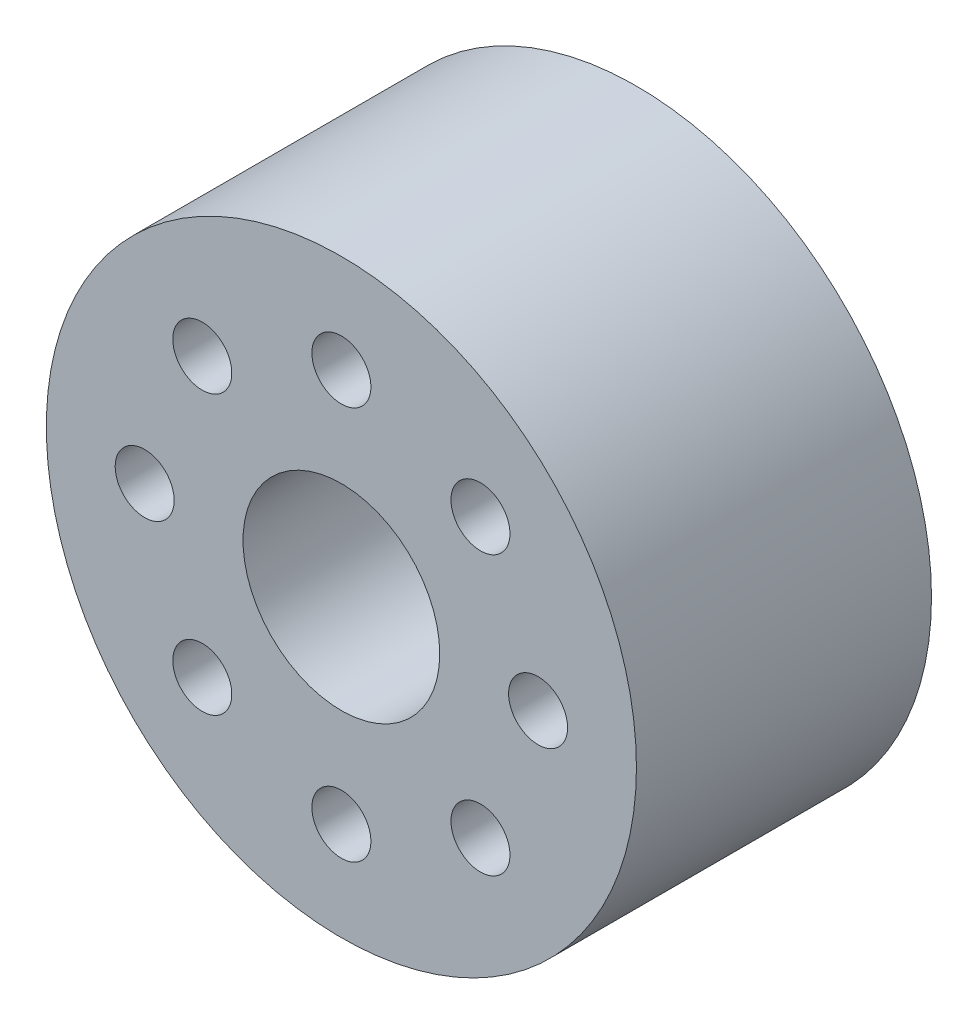
ISO-10303-21;
HEADER;
FILE_DESCRIPTION(('STEP AP214'),'2;1');
FILE_NAME('part.step','',(''),(''),'','','');
FILE_SCHEMA(('AUTOMOTIVE_DESIGN { 1 0 10303 214 1 1 1 1 }'));
ENDSEC;
DATA;
#1=APPLICATION_CONTEXT('core data for automotive mechanical design processes');
#2=APPLICATION_PROTOCOL_DEFINITION('international standard','automotive_design',2000,#1);
#3=PRODUCT_CONTEXT('',#1,'mechanical');
#4=PRODUCT('Part','Part','',(#3));
#5=PRODUCT_RELATED_PRODUCT_CATEGORY('part','',(#4));
#6=PRODUCT_DEFINITION_FORMATION('','',#4);
#7=PRODUCT_DEFINITION_CONTEXT('part definition',#1,'design');
#8=PRODUCT_DEFINITION('design','',#6,#7);
#9=PRODUCT_DEFINITION_SHAPE('','',#8);
#10=(LENGTH_UNIT() NAMED_UNIT(*) SI_UNIT(.MILLI.,.METRE.));
#11=(NAMED_UNIT(*) PLANE_ANGLE_UNIT() SI_UNIT($,.RADIAN.));
#12=(NAMED_UNIT(*) SI_UNIT($,.STERADIAN.) SOLID_ANGLE_UNIT());
#13=UNCERTAINTY_MEASURE_WITH_UNIT(LENGTH_MEASURE(1.E-05),#10,'distance_accuracy_value','');
#14=(GEOMETRIC_REPRESENTATION_CONTEXT(3) GLOBAL_UNCERTAINTY_ASSIGNED_CONTEXT((#13)) GLOBAL_UNIT_ASSIGNED_CONTEXT((#10,
#11,#12)) REPRESENTATION_CONTEXT('',''));
#15=CARTESIAN_POINT('',(0.,0.,0.));
#16=DIRECTION('',(0.,0.,1.));
#17=DIRECTION('',(1.,0.,0.));
#18=AXIS2_PLACEMENT_3D('',#15,#16,#17);
#19=CARTESIAN_POINT('',(0.,0.,12.));
#20=DIRECTION('',(0.,0.,-1.));
#21=DIRECTION('',(-1.,0.,0.));
#22=AXIS2_PLACEMENT_3D('',#19,#20,#21);
#23=CYLINDRICAL_SURFACE('',#22,12.);
#24=CARTESIAN_POINT('',(0.,0.,12.));
#25=DIRECTION('',(0.,0.,1.));
#26=DIRECTION('',(1.,0.,0.));
#27=AXIS2_PLACEMENT_3D('',#24,#25,#26);
#28=CIRCLE('',#27,12.);
#29=CARTESIAN_POINT('',(12.,0.,12.));
#30=VERTEX_POINT('',#29);
#31=EDGE_CURVE('E10',#30,#30,#28,.T.);
#32=ORIENTED_EDGE('',*,*,#31,.F.);
#33=EDGE_LOOP('',(#32));
#34=FACE_BOUND('',#33,.T.);
#35=CARTESIAN_POINT('',(0.,0.,0.));
#36=DIRECTION('',(0.,0.,1.));
#37=DIRECTION('',(1.,0.,0.));
#38=AXIS2_PLACEMENT_3D('',#35,#36,#37);
#39=CIRCLE('',#38,12.);
#40=CARTESIAN_POINT('',(12.,0.,0.));
#41=VERTEX_POINT('',#40);
#42=EDGE_CURVE('E46',#41,#41,#39,.T.);
#43=ORIENTED_EDGE('',*,*,#42,.T.);
#44=EDGE_LOOP('',(#43));
#45=FACE_BOUND('',#44,.T.);
#46=ADVANCED_FACE('F43',(#34,#45),#23,.T.);
#47=CARTESIAN_POINT('',(0.,0.,12.));
#48=DIRECTION('',(0.,0.,1.));
#49=DIRECTION('',(1.,0.,0.));
#50=AXIS2_PLACEMENT_3D('',#47,#48,#49);
#51=PLANE('',#50);
#52=CARTESIAN_POINT('',(0.,8.,12.));
#53=DIRECTION('',(0.,0.,-1.));
#54=DIRECTION('',(-1.,0.,0.));
#55=AXIS2_PLACEMENT_3D('',#52,#53,#54);
#56=CIRCLE('',#55,1.2);
#57=CARTESIAN_POINT('',(-1.2,8.,12.));
#58=VERTEX_POINT('',#57);
#59=EDGE_CURVE('E176',#58,#58,#56,.T.);
#60=ORIENTED_EDGE('',*,*,#59,.T.);
#61=EDGE_LOOP('',(#60));
#62=FACE_BOUND('',#61,.T.);
#63=CARTESIAN_POINT('',(5.65685424949248,5.65685424949262,12.));
#64=DIRECTION('',(0.,0.,-1.));
#65=DIRECTION('',(-1.,0.,0.));
#66=AXIS2_PLACEMENT_3D('',#63,#64,#65);
#67=CIRCLE('',#66,1.2);
#68=CARTESIAN_POINT('',(4.45685424949248,5.65685424949262,12.));
#69=VERTEX_POINT('',#68);
#70=EDGE_CURVE('E160',#69,#69,#67,.T.);
#71=ORIENTED_EDGE('',*,*,#70,.T.);
#72=EDGE_LOOP('',(#71));
#73=FACE_BOUND('',#72,.T.);
#74=CARTESIAN_POINT('',(8.00000000000034,3.39590937005871E-13,12.));
#75=DIRECTION('',(0.,0.,-1.));
#76=DIRECTION('',(-1.,0.,0.));
#77=AXIS2_PLACEMENT_3D('',#74,#75,#76);
#78=CIRCLE('',#77,1.2);
#79=CARTESIAN_POINT('',(6.80000000000034,3.39590937005871E-13,12.));
#80=VERTEX_POINT('',#79);
#81=EDGE_CURVE('E144',#80,#80,#78,.T.);
#82=ORIENTED_EDGE('',*,*,#81,.T.);
#83=EDGE_LOOP('',(#82));
#84=FACE_BOUND('',#83,.T.);
#85=CARTESIAN_POINT('',(5.65685424949296,-5.65685424949214,12.));
#86=DIRECTION('',(0.,0.,-1.));
#87=DIRECTION('',(-1.,0.,0.));
#88=AXIS2_PLACEMENT_3D('',#85,#86,#87);
#89=CIRCLE('',#88,1.2);
#90=CARTESIAN_POINT('',(4.45685424949296,-5.65685424949214,12.));
#91=VERTEX_POINT('',#90);
#92=EDGE_CURVE('E128',#91,#91,#89,.T.);
#93=ORIENTED_EDGE('',*,*,#92,.T.);
#94=EDGE_LOOP('',(#93));
#95=FACE_BOUND('',#94,.T.);
#96=CARTESIAN_POINT('',(6.79181874011743E-13,-8.,12.));
#97=DIRECTION('',(0.,0.,-1.));
#98=DIRECTION('',(-1.,0.,0.));
#99=AXIS2_PLACEMENT_3D('',#96,#97,#98);
#100=CIRCLE('',#99,1.2);
#101=CARTESIAN_POINT('',(-1.19999999999932,-8.,12.));
#102=VERTEX_POINT('',#101);
#103=EDGE_CURVE('E112',#102,#102,#100,.T.);
#104=ORIENTED_EDGE('',*,*,#103,.T.);
#105=EDGE_LOOP('',(#104));
#106=FACE_BOUND('',#105,.T.);
#107=CARTESIAN_POINT('',(-5.6568542494918,-5.65685424949262,12.));
#108=DIRECTION('',(0.,0.,-1.));
#109=DIRECTION('',(-1.,0.,0.));
#110=AXIS2_PLACEMENT_3D('',#107,#108,#109);
#111=CIRCLE('',#110,1.2);
#112=CARTESIAN_POINT('',(-6.8568542494918,-5.65685424949262,12.));
#113=VERTEX_POINT('',#112);
#114=EDGE_CURVE('E96',#113,#113,#111,.T.);
#115=ORIENTED_EDGE('',*,*,#114,.T.);
#116=EDGE_LOOP('',(#115));
#117=FACE_BOUND('',#116,.T.);
#118=CARTESIAN_POINT('',(-7.99999999999966,-3.40570654445189E-13,12.));
#119=DIRECTION('',(0.,0.,-1.));
#120=DIRECTION('',(-1.,0.,0.));
#121=AXIS2_PLACEMENT_3D('',#118,#119,#120);
#122=CIRCLE('',#121,1.2);
#123=CARTESIAN_POINT('',(-9.19999999999966,-3.40570654445189E-13,12.));
#124=VERTEX_POINT('',#123);
#125=EDGE_CURVE('E80',#124,#124,#122,.T.);
#126=ORIENTED_EDGE('',*,*,#125,.T.);
#127=EDGE_LOOP('',(#126));
#128=FACE_BOUND('',#127,.T.);
#129=CARTESIAN_POINT('',(-5.65685424949228,5.65685424949214,12.));
#130=DIRECTION('',(0.,0.,-1.));
#131=DIRECTION('',(-1.,0.,0.));
#132=AXIS2_PLACEMENT_3D('',#129,#130,#131);
#133=CIRCLE('',#132,1.2);
#134=CARTESIAN_POINT('',(-6.85685424949228,5.65685424949214,12.));
#135=VERTEX_POINT('',#134);
#136=EDGE_CURVE('E64',#135,#135,#133,.T.);
#137=ORIENTED_EDGE('',*,*,#136,.T.);
#138=EDGE_LOOP('',(#137));
#139=FACE_BOUND('',#138,.T.);
#140=CARTESIAN_POINT('',(0.,0.,12.));
#141=DIRECTION('',(0.,0.,1.));
#142=DIRECTION('',(1.,0.,0.));
#143=AXIS2_PLACEMENT_3D('',#140,#141,#142);
#144=CIRCLE('',#143,4.);
#145=CARTESIAN_POINT('',(4.,0.,12.));
#146=VERTEX_POINT('',#145);
#147=EDGE_CURVE('E60',#146,#146,#144,.T.);
#148=ORIENTED_EDGE('',*,*,#147,.F.);
#149=EDGE_LOOP('',(#148));
#150=FACE_BOUND('',#149,.T.);
#151=ORIENTED_EDGE('',*,*,#31,.T.);
#152=EDGE_LOOP('',(#151));
#153=FACE_BOUND('',#152,.T.);
#154=ADVANCED_FACE('F199',(#62,#73,#84,#95,#106,#117,#128,#139,#150,#153),#51,.T.);
#155=CARTESIAN_POINT('',(0.,0.,0.));
#156=DIRECTION('',(0.,0.,1.));
#157=DIRECTION('',(1.,0.,0.));
#158=AXIS2_PLACEMENT_3D('',#155,#156,#157);
#159=PLANE('',#158);
#160=CARTESIAN_POINT('',(0.,8.,0.));
#161=DIRECTION('',(0.,0.,-1.));
#162=DIRECTION('',(-1.,0.,0.));
#163=AXIS2_PLACEMENT_3D('',#160,#161,#162);
#164=CIRCLE('',#163,2.2);
#165=CARTESIAN_POINT('',(-2.2,8.,0.));
#166=VERTEX_POINT('',#165);
#167=EDGE_CURVE('E188',#166,#166,#164,.T.);
#168=ORIENTED_EDGE('',*,*,#167,.F.);
#169=EDGE_LOOP('',(#168));
#170=FACE_BOUND('',#169,.T.);
#171=CARTESIAN_POINT('',(5.65685424949248,5.65685424949262,0.));
#172=DIRECTION('',(0.,0.,-1.));
#173=DIRECTION('',(-1.,0.,0.));
#174=AXIS2_PLACEMENT_3D('',#171,#172,#173);
#175=CIRCLE('',#174,2.2);
#176=CARTESIAN_POINT('',(3.45685424949248,5.65685424949262,0.));
#177=VERTEX_POINT('',#176);
#178=EDGE_CURVE('E172',#177,#177,#175,.T.);
#179=ORIENTED_EDGE('',*,*,#178,.F.);
#180=EDGE_LOOP('',(#179));
#181=FACE_BOUND('',#180,.T.);
#182=CARTESIAN_POINT('',(8.00000000000034,3.39590937005871E-13,0.));
#183=DIRECTION('',(0.,0.,-1.));
#184=DIRECTION('',(-1.,0.,0.));
#185=AXIS2_PLACEMENT_3D('',#182,#183,#184);
#186=CIRCLE('',#185,2.2);
#187=CARTESIAN_POINT('',(5.80000000000034,3.39590937005871E-13,0.));
#188=VERTEX_POINT('',#187);
#189=EDGE_CURVE('E156',#188,#188,#186,.T.);
#190=ORIENTED_EDGE('',*,*,#189,.F.);
#191=EDGE_LOOP('',(#190));
#192=FACE_BOUND('',#191,.T.);
#193=CARTESIAN_POINT('',(5.65685424949296,-5.65685424949214,0.));
#194=DIRECTION('',(0.,0.,-1.));
#195=DIRECTION('',(-1.,0.,0.));
#196=AXIS2_PLACEMENT_3D('',#193,#194,#195);
#197=CIRCLE('',#196,2.2);
#198=CARTESIAN_POINT('',(3.45685424949296,-5.65685424949214,0.));
#199=VERTEX_POINT('',#198);
#200=EDGE_CURVE('E140',#199,#199,#197,.T.);
#201=ORIENTED_EDGE('',*,*,#200,.F.);
#202=EDGE_LOOP('',(#201));
#203=FACE_BOUND('',#202,.T.);
#204=CARTESIAN_POINT('',(6.79181874011743E-13,-8.,0.));
#205=DIRECTION('',(0.,0.,-1.));
#206=DIRECTION('',(-1.,0.,0.));
#207=AXIS2_PLACEMENT_3D('',#204,#205,#206);
#208=CIRCLE('',#207,2.2);
#209=CARTESIAN_POINT('',(-2.19999999999932,-8.,0.));
#210=VERTEX_POINT('',#209);
#211=EDGE_CURVE('E124',#210,#210,#208,.T.);
#212=ORIENTED_EDGE('',*,*,#211,.F.);
#213=EDGE_LOOP('',(#212));
#214=FACE_BOUND('',#213,.T.);
#215=CARTESIAN_POINT('',(-5.6568542494918,-5.65685424949262,0.));
#216=DIRECTION('',(0.,0.,-1.));
#217=DIRECTION('',(-1.,0.,0.));
#218=AXIS2_PLACEMENT_3D('',#215,#216,#217);
#219=CIRCLE('',#218,2.2);
#220=CARTESIAN_POINT('',(-7.8568542494918,-5.65685424949262,0.));
#221=VERTEX_POINT('',#220);
#222=EDGE_CURVE('E108',#221,#221,#219,.T.);
#223=ORIENTED_EDGE('',*,*,#222,.F.);
#224=EDGE_LOOP('',(#223));
#225=FACE_BOUND('',#224,.T.);
#226=CARTESIAN_POINT('',(-7.99999999999966,-3.40570654445189E-13,0.));
#227=DIRECTION('',(0.,0.,-1.));
#228=DIRECTION('',(-1.,0.,0.));
#229=AXIS2_PLACEMENT_3D('',#226,#227,#228);
#230=CIRCLE('',#229,2.2);
#231=CARTESIAN_POINT('',(-10.1999999999997,-3.40570654445189E-13,0.));
#232=VERTEX_POINT('',#231);
#233=EDGE_CURVE('E92',#232,#232,#230,.T.);
#234=ORIENTED_EDGE('',*,*,#233,.F.);
#235=EDGE_LOOP('',(#234));
#236=FACE_BOUND('',#235,.T.);
#237=CARTESIAN_POINT('',(-5.65685424949228,5.65685424949214,0.));
#238=DIRECTION('',(0.,0.,-1.));
#239=DIRECTION('',(-1.,0.,0.));
#240=AXIS2_PLACEMENT_3D('',#237,#238,#239);
#241=CIRCLE('',#240,2.2);
#242=CARTESIAN_POINT('',(-7.85685424949228,5.65685424949214,0.));
#243=VERTEX_POINT('',#242);
#244=EDGE_CURVE('E76',#243,#243,#241,.T.);
#245=ORIENTED_EDGE('',*,*,#244,.F.);
#246=EDGE_LOOP('',(#245));
#247=FACE_BOUND('',#246,.T.);
#248=CARTESIAN_POINT('',(0.,0.,0.));
#249=DIRECTION('',(0.,0.,1.));
#250=DIRECTION('',(1.,0.,0.));
#251=AXIS2_PLACEMENT_3D('',#248,#249,#250);
#252=CIRCLE('',#251,4.);
#253=CARTESIAN_POINT('',(4.,0.,0.));
#254=VERTEX_POINT('',#253);
#255=EDGE_CURVE('E55',#254,#254,#252,.T.);
#256=ORIENTED_EDGE('',*,*,#255,.T.);
#257=EDGE_LOOP('',(#256));
#258=FACE_BOUND('',#257,.T.);
#259=ORIENTED_EDGE('',*,*,#42,.F.);
#260=EDGE_LOOP('',(#259));
#261=FACE_BOUND('',#260,.T.);
#262=ADVANCED_FACE('F195',(#170,#181,#192,#203,#214,#225,#236,#247,#258,#261),#159,.F.);
#263=CARTESIAN_POINT('',(0.,0.,12.));
#264=DIRECTION('',(0.,0.,1.));
#265=DIRECTION('',(1.,0.,0.));
#266=AXIS2_PLACEMENT_3D('',#263,#264,#265);
#267=CYLINDRICAL_SURFACE('',#266,4.);
#268=ORIENTED_EDGE('',*,*,#255,.F.);
#269=EDGE_LOOP('',(#268));
#270=FACE_BOUND('',#269,.T.);
#271=ORIENTED_EDGE('',*,*,#147,.T.);
#272=EDGE_LOOP('',(#271));
#273=FACE_BOUND('',#272,.T.);
#274=ADVANCED_FACE('F198',(#270,#273),#267,.F.);
#275=CARTESIAN_POINT('',(-5.65685424949228,5.65685424949214,0.));
#276=DIRECTION('',(0.,0.,-1.));
#277=DIRECTION('',(-1.,0.,0.));
#278=AXIS2_PLACEMENT_3D('',#275,#276,#277);
#279=CYLINDRICAL_SURFACE('',#278,1.2);
#280=ORIENTED_EDGE('',*,*,#136,.F.);
#281=EDGE_LOOP('',(#280));
#282=FACE_BOUND('',#281,.T.);
#283=CARTESIAN_POINT('',(-5.65685424949228,5.65685424949214,5.5));
#284=DIRECTION('',(0.,0.,-1.));
#285=DIRECTION('',(-1.,0.,0.));
#286=AXIS2_PLACEMENT_3D('',#283,#284,#285);
#287=CIRCLE('',#286,1.2);
#288=CARTESIAN_POINT('',(-6.85685424949228,5.65685424949214,5.5));
#289=VERTEX_POINT('',#288);
#290=EDGE_CURVE('E68',#289,#289,#287,.T.);
#291=ORIENTED_EDGE('',*,*,#290,.T.);
#292=EDGE_LOOP('',(#291));
#293=FACE_BOUND('',#292,.T.);
#294=ADVANCED_FACE('F231',(#282,#293),#279,.F.);
#295=CARTESIAN_POINT('',(-4.45685424949228,5.65685424949214,5.5));
#296=DIRECTION('',(0.,0.,1.));
#297=DIRECTION('',(1.,0.,0.));
#298=AXIS2_PLACEMENT_3D('',#295,#296,#297);
#299=PLANE('',#298);
#300=ORIENTED_EDGE('',*,*,#290,.F.);
#301=EDGE_LOOP('',(#300));
#302=FACE_BOUND('',#301,.T.);
#303=CARTESIAN_POINT('',(-5.65685424949228,5.65685424949214,5.5));
#304=DIRECTION('',(0.,0.,-1.));
#305=DIRECTION('',(-1.,0.,0.));
#306=AXIS2_PLACEMENT_3D('',#303,#304,#305);
#307=CIRCLE('',#306,2.2);
#308=CARTESIAN_POINT('',(-7.85685424949228,5.65685424949214,5.5));
#309=VERTEX_POINT('',#308);
#310=EDGE_CURVE('E72',#309,#309,#307,.T.);
#311=ORIENTED_EDGE('',*,*,#310,.T.);
#312=EDGE_LOOP('',(#311));
#313=FACE_BOUND('',#312,.T.);
#314=ADVANCED_FACE('F235',(#302,#313),#299,.F.);
#315=CARTESIAN_POINT('',(-5.65685424949228,5.65685424949214,0.));
#316=DIRECTION('',(0.,0.,-1.));
#317=DIRECTION('',(-1.,0.,0.));
#318=AXIS2_PLACEMENT_3D('',#315,#316,#317);
#319=CYLINDRICAL_SURFACE('',#318,2.2);
#320=ORIENTED_EDGE('',*,*,#310,.F.);
#321=EDGE_LOOP('',(#320));
#322=FACE_BOUND('',#321,.T.);
#323=ORIENTED_EDGE('',*,*,#244,.T.);
#324=EDGE_LOOP('',(#323));
#325=FACE_BOUND('',#324,.T.);
#326=ADVANCED_FACE('F239',(#322,#325),#319,.F.);
#327=CARTESIAN_POINT('',(-7.99999999999966,-3.40570654445189E-13,0.));
#328=DIRECTION('',(0.,0.,-1.));
#329=DIRECTION('',(-1.,0.,0.));
#330=AXIS2_PLACEMENT_3D('',#327,#328,#329);
#331=CYLINDRICAL_SURFACE('',#330,1.2);
#332=ORIENTED_EDGE('',*,*,#125,.F.);
#333=EDGE_LOOP('',(#332));
#334=FACE_BOUND('',#333,.T.);
#335=CARTESIAN_POINT('',(-7.99999999999966,-3.40570654445189E-13,5.5));
#336=DIRECTION('',(0.,0.,-1.));
#337=DIRECTION('',(-1.,0.,0.));
#338=AXIS2_PLACEMENT_3D('',#335,#336,#337);
#339=CIRCLE('',#338,1.2);
#340=CARTESIAN_POINT('',(-9.19999999999966,-3.40570654445189E-13,5.5));
#341=VERTEX_POINT('',#340);
#342=EDGE_CURVE('E84',#341,#341,#339,.T.);
#343=ORIENTED_EDGE('',*,*,#342,.T.);
#344=EDGE_LOOP('',(#343));
#345=FACE_BOUND('',#344,.T.);
#346=ADVANCED_FACE('F243',(#334,#345),#331,.F.);
#347=CARTESIAN_POINT('',(-6.79999999999966,-3.40570654445189E-13,5.5));
#348=DIRECTION('',(0.,0.,1.));
#349=DIRECTION('',(1.,0.,0.));
#350=AXIS2_PLACEMENT_3D('',#347,#348,#349);
#351=PLANE('',#350);
#352=ORIENTED_EDGE('',*,*,#342,.F.);
#353=EDGE_LOOP('',(#352));
#354=FACE_BOUND('',#353,.T.);
#355=CARTESIAN_POINT('',(-7.99999999999966,-3.40570654445189E-13,5.5));
#356=DIRECTION('',(0.,0.,-1.));
#357=DIRECTION('',(-1.,0.,0.));
#358=AXIS2_PLACEMENT_3D('',#355,#356,#357);
#359=CIRCLE('',#358,2.2);
#360=CARTESIAN_POINT('',(-10.1999999999997,-3.40570654445189E-13,5.5));
#361=VERTEX_POINT('',#360);
#362=EDGE_CURVE('E88',#361,#361,#359,.T.);
#363=ORIENTED_EDGE('',*,*,#362,.T.);
#364=EDGE_LOOP('',(#363));
#365=FACE_BOUND('',#364,.T.);
#366=ADVANCED_FACE('F247',(#354,#365),#351,.F.);
#367=CARTESIAN_POINT('',(-7.99999999999966,-3.40570654445189E-13,0.));
#368=DIRECTION('',(0.,0.,-1.));
#369=DIRECTION('',(-1.,0.,0.));
#370=AXIS2_PLACEMENT_3D('',#367,#368,#369);
#371=CYLINDRICAL_SURFACE('',#370,2.2);
#372=ORIENTED_EDGE('',*,*,#362,.F.);
#373=EDGE_LOOP('',(#372));
#374=FACE_BOUND('',#373,.T.);
#375=ORIENTED_EDGE('',*,*,#233,.T.);
#376=EDGE_LOOP('',(#375));
#377=FACE_BOUND('',#376,.T.);
#378=ADVANCED_FACE('F251',(#374,#377),#371,.F.);
#379=CARTESIAN_POINT('',(-5.6568542494918,-5.65685424949262,0.));
#380=DIRECTION('',(0.,0.,-1.));
#381=DIRECTION('',(-1.,0.,0.));
#382=AXIS2_PLACEMENT_3D('',#379,#380,#381);
#383=CYLINDRICAL_SURFACE('',#382,1.2);
#384=ORIENTED_EDGE('',*,*,#114,.F.);
#385=EDGE_LOOP('',(#384));
#386=FACE_BOUND('',#385,.T.);
#387=CARTESIAN_POINT('',(-5.6568542494918,-5.65685424949262,5.5));
#388=DIRECTION('',(0.,0.,-1.));
#389=DIRECTION('',(-1.,0.,0.));
#390=AXIS2_PLACEMENT_3D('',#387,#388,#389);
#391=CIRCLE('',#390,1.2);
#392=CARTESIAN_POINT('',(-6.8568542494918,-5.65685424949262,5.5));
#393=VERTEX_POINT('',#392);
#394=EDGE_CURVE('E100',#393,#393,#391,.T.);
#395=ORIENTED_EDGE('',*,*,#394,.T.);
#396=EDGE_LOOP('',(#395));
#397=FACE_BOUND('',#396,.T.);
#398=ADVANCED_FACE('F255',(#386,#397),#383,.F.);
#399=CARTESIAN_POINT('',(-4.4568542494918,-5.65685424949262,5.5));
#400=DIRECTION('',(0.,0.,1.));
#401=DIRECTION('',(1.,0.,0.));
#402=AXIS2_PLACEMENT_3D('',#399,#400,#401);
#403=PLANE('',#402);
#404=ORIENTED_EDGE('',*,*,#394,.F.);
#405=EDGE_LOOP('',(#404));
#406=FACE_BOUND('',#405,.T.);
#407=CARTESIAN_POINT('',(-5.6568542494918,-5.65685424949262,5.5));
#408=DIRECTION('',(0.,0.,-1.));
#409=DIRECTION('',(-1.,0.,0.));
#410=AXIS2_PLACEMENT_3D('',#407,#408,#409);
#411=CIRCLE('',#410,2.2);
#412=CARTESIAN_POINT('',(-7.8568542494918,-5.65685424949262,5.5));
#413=VERTEX_POINT('',#412);
#414=EDGE_CURVE('E104',#413,#413,#411,.T.);
#415=ORIENTED_EDGE('',*,*,#414,.T.);
#416=EDGE_LOOP('',(#415));
#417=FACE_BOUND('',#416,.T.);
#418=ADVANCED_FACE('F259',(#406,#417),#403,.F.);
#419=CARTESIAN_POINT('',(-5.6568542494918,-5.65685424949262,0.));
#420=DIRECTION('',(0.,0.,-1.));
#421=DIRECTION('',(-1.,0.,0.));
#422=AXIS2_PLACEMENT_3D('',#419,#420,#421);
#423=CYLINDRICAL_SURFACE('',#422,2.2);
#424=ORIENTED_EDGE('',*,*,#414,.F.);
#425=EDGE_LOOP('',(#424));
#426=FACE_BOUND('',#425,.T.);
#427=ORIENTED_EDGE('',*,*,#222,.T.);
#428=EDGE_LOOP('',(#427));
#429=FACE_BOUND('',#428,.T.);
#430=ADVANCED_FACE('F263',(#426,#429),#423,.F.);
#431=CARTESIAN_POINT('',(6.79181874011743E-13,-8.,0.));
#432=DIRECTION('',(0.,0.,-1.));
#433=DIRECTION('',(-1.,0.,0.));
#434=AXIS2_PLACEMENT_3D('',#431,#432,#433);
#435=CYLINDRICAL_SURFACE('',#434,1.2);
#436=ORIENTED_EDGE('',*,*,#103,.F.);
#437=EDGE_LOOP('',(#436));
#438=FACE_BOUND('',#437,.T.);
#439=CARTESIAN_POINT('',(6.79181874011743E-13,-8.,5.5));
#440=DIRECTION('',(0.,0.,-1.));
#441=DIRECTION('',(-1.,0.,0.));
#442=AXIS2_PLACEMENT_3D('',#439,#440,#441);
#443=CIRCLE('',#442,1.2);
#444=CARTESIAN_POINT('',(-1.19999999999932,-8.,5.5));
#445=VERTEX_POINT('',#444);
#446=EDGE_CURVE('E116',#445,#445,#443,.T.);
#447=ORIENTED_EDGE('',*,*,#446,.T.);
#448=EDGE_LOOP('',(#447));
#449=FACE_BOUND('',#448,.T.);
#450=ADVANCED_FACE('F267',(#438,#449),#435,.F.);
#451=CARTESIAN_POINT('',(1.20000000000068,-8.,5.5));
#452=DIRECTION('',(0.,0.,1.));
#453=DIRECTION('',(1.,0.,0.));
#454=AXIS2_PLACEMENT_3D('',#451,#452,#453);
#455=PLANE('',#454);
#456=ORIENTED_EDGE('',*,*,#446,.F.);
#457=EDGE_LOOP('',(#456));
#458=FACE_BOUND('',#457,.T.);
#459=CARTESIAN_POINT('',(6.79181874011743E-13,-8.,5.5));
#460=DIRECTION('',(0.,0.,-1.));
#461=DIRECTION('',(-1.,0.,0.));
#462=AXIS2_PLACEMENT_3D('',#459,#460,#461);
#463=CIRCLE('',#462,2.2);
#464=CARTESIAN_POINT('',(-2.19999999999932,-8.,5.5));
#465=VERTEX_POINT('',#464);
#466=EDGE_CURVE('E120',#465,#465,#463,.T.);
#467=ORIENTED_EDGE('',*,*,#466,.T.);
#468=EDGE_LOOP('',(#467));
#469=FACE_BOUND('',#468,.T.);
#470=ADVANCED_FACE('F271',(#458,#469),#455,.F.);
#471=CARTESIAN_POINT('',(6.79181874011743E-13,-8.,0.));
#472=DIRECTION('',(0.,0.,-1.));
#473=DIRECTION('',(-1.,0.,0.));
#474=AXIS2_PLACEMENT_3D('',#471,#472,#473);
#475=CYLINDRICAL_SURFACE('',#474,2.2);
#476=ORIENTED_EDGE('',*,*,#466,.F.);
#477=EDGE_LOOP('',(#476));
#478=FACE_BOUND('',#477,.T.);
#479=ORIENTED_EDGE('',*,*,#211,.T.);
#480=EDGE_LOOP('',(#479));
#481=FACE_BOUND('',#480,.T.);
#482=ADVANCED_FACE('F275',(#478,#481),#475,.F.);
#483=CARTESIAN_POINT('',(5.65685424949296,-5.65685424949214,0.));
#484=DIRECTION('',(0.,0.,-1.));
#485=DIRECTION('',(-1.,0.,0.));
#486=AXIS2_PLACEMENT_3D('',#483,#484,#485);
#487=CYLINDRICAL_SURFACE('',#486,1.2);
#488=ORIENTED_EDGE('',*,*,#92,.F.);
#489=EDGE_LOOP('',(#488));
#490=FACE_BOUND('',#489,.T.);
#491=CARTESIAN_POINT('',(5.65685424949296,-5.65685424949214,5.5));
#492=DIRECTION('',(0.,0.,-1.));
#493=DIRECTION('',(-1.,0.,0.));
#494=AXIS2_PLACEMENT_3D('',#491,#492,#493);
#495=CIRCLE('',#494,1.2);
#496=CARTESIAN_POINT('',(4.45685424949296,-5.65685424949214,5.5));
#497=VERTEX_POINT('',#496);
#498=EDGE_CURVE('E132',#497,#497,#495,.T.);
#499=ORIENTED_EDGE('',*,*,#498,.T.);
#500=EDGE_LOOP('',(#499));
#501=FACE_BOUND('',#500,.T.);
#502=ADVANCED_FACE('F279',(#490,#501),#487,.F.);
#503=CARTESIAN_POINT('',(6.85685424949296,-5.65685424949214,5.5));
#504=DIRECTION('',(0.,0.,1.));
#505=DIRECTION('',(1.,0.,0.));
#506=AXIS2_PLACEMENT_3D('',#503,#504,#505);
#507=PLANE('',#506);
#508=ORIENTED_EDGE('',*,*,#498,.F.);
#509=EDGE_LOOP('',(#508));
#510=FACE_BOUND('',#509,.T.);
#511=CARTESIAN_POINT('',(5.65685424949296,-5.65685424949214,5.5));
#512=DIRECTION('',(0.,0.,-1.));
#513=DIRECTION('',(-1.,0.,0.));
#514=AXIS2_PLACEMENT_3D('',#511,#512,#513);
#515=CIRCLE('',#514,2.2);
#516=CARTESIAN_POINT('',(3.45685424949296,-5.65685424949214,5.5));
#517=VERTEX_POINT('',#516);
#518=EDGE_CURVE('E136',#517,#517,#515,.T.);
#519=ORIENTED_EDGE('',*,*,#518,.T.);
#520=EDGE_LOOP('',(#519));
#521=FACE_BOUND('',#520,.T.);
#522=ADVANCED_FACE('F283',(#510,#521),#507,.F.);
#523=CARTESIAN_POINT('',(5.65685424949296,-5.65685424949214,0.));
#524=DIRECTION('',(0.,0.,-1.));
#525=DIRECTION('',(-1.,0.,0.));
#526=AXIS2_PLACEMENT_3D('',#523,#524,#525);
#527=CYLINDRICAL_SURFACE('',#526,2.2);
#528=ORIENTED_EDGE('',*,*,#518,.F.);
#529=EDGE_LOOP('',(#528));
#530=FACE_BOUND('',#529,.T.);
#531=ORIENTED_EDGE('',*,*,#200,.T.);
#532=EDGE_LOOP('',(#531));
#533=FACE_BOUND('',#532,.T.);
#534=ADVANCED_FACE('F287',(#530,#533),#527,.F.);
#535=CARTESIAN_POINT('',(8.00000000000034,3.39590937005871E-13,0.));
#536=DIRECTION('',(0.,0.,-1.));
#537=DIRECTION('',(-1.,0.,0.));
#538=AXIS2_PLACEMENT_3D('',#535,#536,#537);
#539=CYLINDRICAL_SURFACE('',#538,1.2);
#540=ORIENTED_EDGE('',*,*,#81,.F.);
#541=EDGE_LOOP('',(#540));
#542=FACE_BOUND('',#541,.T.);
#543=CARTESIAN_POINT('',(8.00000000000034,3.39590937005871E-13,5.5));
#544=DIRECTION('',(0.,0.,-1.));
#545=DIRECTION('',(-1.,0.,0.));
#546=AXIS2_PLACEMENT_3D('',#543,#544,#545);
#547=CIRCLE('',#546,1.2);
#548=CARTESIAN_POINT('',(6.80000000000034,3.39590937005871E-13,5.5));
#549=VERTEX_POINT('',#548);
#550=EDGE_CURVE('E148',#549,#549,#547,.T.);
#551=ORIENTED_EDGE('',*,*,#550,.T.);
#552=EDGE_LOOP('',(#551));
#553=FACE_BOUND('',#552,.T.);
#554=ADVANCED_FACE('F291',(#542,#553),#539,.F.);
#555=CARTESIAN_POINT('',(9.20000000000034,3.39590937005871E-13,5.5));
#556=DIRECTION('',(0.,0.,1.));
#557=DIRECTION('',(1.,0.,0.));
#558=AXIS2_PLACEMENT_3D('',#555,#556,#557);
#559=PLANE('',#558);
#560=ORIENTED_EDGE('',*,*,#550,.F.);
#561=EDGE_LOOP('',(#560));
#562=FACE_BOUND('',#561,.T.);
#563=CARTESIAN_POINT('',(8.00000000000034,3.39590937005871E-13,5.5));
#564=DIRECTION('',(0.,0.,-1.));
#565=DIRECTION('',(-1.,0.,0.));
#566=AXIS2_PLACEMENT_3D('',#563,#564,#565);
#567=CIRCLE('',#566,2.2);
#568=CARTESIAN_POINT('',(5.80000000000034,3.39590937005871E-13,5.5));
#569=VERTEX_POINT('',#568);
#570=EDGE_CURVE('E152',#569,#569,#567,.T.);
#571=ORIENTED_EDGE('',*,*,#570,.T.);
#572=EDGE_LOOP('',(#571));
#573=FACE_BOUND('',#572,.T.);
#574=ADVANCED_FACE('F295',(#562,#573),#559,.F.);
#575=CARTESIAN_POINT('',(8.00000000000034,3.39590937005871E-13,0.));
#576=DIRECTION('',(0.,0.,-1.));
#577=DIRECTION('',(-1.,0.,0.));
#578=AXIS2_PLACEMENT_3D('',#575,#576,#577);
#579=CYLINDRICAL_SURFACE('',#578,2.2);
#580=ORIENTED_EDGE('',*,*,#570,.F.);
#581=EDGE_LOOP('',(#580));
#582=FACE_BOUND('',#581,.T.);
#583=ORIENTED_EDGE('',*,*,#189,.T.);
#584=EDGE_LOOP('',(#583));
#585=FACE_BOUND('',#584,.T.);
#586=ADVANCED_FACE('F299',(#582,#585),#579,.F.);
#587=CARTESIAN_POINT('',(5.65685424949248,5.65685424949262,0.));
#588=DIRECTION('',(0.,0.,-1.));
#589=DIRECTION('',(-1.,0.,0.));
#590=AXIS2_PLACEMENT_3D('',#587,#588,#589);
#591=CYLINDRICAL_SURFACE('',#590,1.2);
#592=ORIENTED_EDGE('',*,*,#70,.F.);
#593=EDGE_LOOP('',(#592));
#594=FACE_BOUND('',#593,.T.);
#595=CARTESIAN_POINT('',(5.65685424949248,5.65685424949262,5.5));
#596=DIRECTION('',(0.,0.,-1.));
#597=DIRECTION('',(-1.,0.,0.));
#598=AXIS2_PLACEMENT_3D('',#595,#596,#597);
#599=CIRCLE('',#598,1.2);
#600=CARTESIAN_POINT('',(4.45685424949248,5.65685424949262,5.5));
#601=VERTEX_POINT('',#600);
#602=EDGE_CURVE('E164',#601,#601,#599,.T.);
#603=ORIENTED_EDGE('',*,*,#602,.T.);
#604=EDGE_LOOP('',(#603));
#605=FACE_BOUND('',#604,.T.);
#606=ADVANCED_FACE('F303',(#594,#605),#591,.F.);
#607=CARTESIAN_POINT('',(6.85685424949248,5.65685424949262,5.5));
#608=DIRECTION('',(0.,0.,1.));
#609=DIRECTION('',(1.,0.,0.));
#610=AXIS2_PLACEMENT_3D('',#607,#608,#609);
#611=PLANE('',#610);
#612=ORIENTED_EDGE('',*,*,#602,.F.);
#613=EDGE_LOOP('',(#612));
#614=FACE_BOUND('',#613,.T.);
#615=CARTESIAN_POINT('',(5.65685424949248,5.65685424949262,5.5));
#616=DIRECTION('',(0.,0.,-1.));
#617=DIRECTION('',(-1.,0.,0.));
#618=AXIS2_PLACEMENT_3D('',#615,#616,#617);
#619=CIRCLE('',#618,2.2);
#620=CARTESIAN_POINT('',(3.45685424949248,5.65685424949262,5.5));
#621=VERTEX_POINT('',#620);
#622=EDGE_CURVE('E168',#621,#621,#619,.T.);
#623=ORIENTED_EDGE('',*,*,#622,.T.);
#624=EDGE_LOOP('',(#623));
#625=FACE_BOUND('',#624,.T.);
#626=ADVANCED_FACE('F307',(#614,#625),#611,.F.);
#627=CARTESIAN_POINT('',(5.65685424949248,5.65685424949262,0.));
#628=DIRECTION('',(0.,0.,-1.));
#629=DIRECTION('',(-1.,0.,0.));
#630=AXIS2_PLACEMENT_3D('',#627,#628,#629);
#631=CYLINDRICAL_SURFACE('',#630,2.2);
#632=ORIENTED_EDGE('',*,*,#622,.F.);
#633=EDGE_LOOP('',(#632));
#634=FACE_BOUND('',#633,.T.);
#635=ORIENTED_EDGE('',*,*,#178,.T.);
#636=EDGE_LOOP('',(#635));
#637=FACE_BOUND('',#636,.T.);
#638=ADVANCED_FACE('F311',(#634,#637),#631,.F.);
#639=CARTESIAN_POINT('',(0.,8.,0.));
#640=DIRECTION('',(0.,0.,-1.));
#641=DIRECTION('',(-1.,0.,0.));
#642=AXIS2_PLACEMENT_3D('',#639,#640,#641);
#643=CYLINDRICAL_SURFACE('',#642,1.2);
#644=ORIENTED_EDGE('',*,*,#59,.F.);
#645=EDGE_LOOP('',(#644));
#646=FACE_BOUND('',#645,.T.);
#647=CARTESIAN_POINT('',(0.,8.,5.5));
#648=DIRECTION('',(0.,0.,-1.));
#649=DIRECTION('',(-1.,0.,0.));
#650=AXIS2_PLACEMENT_3D('',#647,#648,#649);
#651=CIRCLE('',#650,1.2);
#652=CARTESIAN_POINT('',(-1.2,8.,5.5));
#653=VERTEX_POINT('',#652);
#654=EDGE_CURVE('E180',#653,#653,#651,.T.);
#655=ORIENTED_EDGE('',*,*,#654,.T.);
#656=EDGE_LOOP('',(#655));
#657=FACE_BOUND('',#656,.T.);
#658=ADVANCED_FACE('F315',(#646,#657),#643,.F.);
#659=CARTESIAN_POINT('',(1.2,8.,5.5));
#660=DIRECTION('',(0.,0.,1.));
#661=DIRECTION('',(1.,0.,0.));
#662=AXIS2_PLACEMENT_3D('',#659,#660,#661);
#663=PLANE('',#662);
#664=ORIENTED_EDGE('',*,*,#654,.F.);
#665=EDGE_LOOP('',(#664));
#666=FACE_BOUND('',#665,.T.);
#667=CARTESIAN_POINT('',(0.,8.,5.5));
#668=DIRECTION('',(0.,0.,-1.));
#669=DIRECTION('',(-1.,0.,0.));
#670=AXIS2_PLACEMENT_3D('',#667,#668,#669);
#671=CIRCLE('',#670,2.2);
#672=CARTESIAN_POINT('',(-2.2,8.,5.5));
#673=VERTEX_POINT('',#672);
#674=EDGE_CURVE('E184',#673,#673,#671,.T.);
#675=ORIENTED_EDGE('',*,*,#674,.T.);
#676=EDGE_LOOP('',(#675));
#677=FACE_BOUND('',#676,.T.);
#678=ADVANCED_FACE('F319',(#666,#677),#663,.F.);
#679=CARTESIAN_POINT('',(0.,8.,0.));
#680=DIRECTION('',(0.,0.,-1.));
#681=DIRECTION('',(-1.,0.,0.));
#682=AXIS2_PLACEMENT_3D('',#679,#680,#681);
#683=CYLINDRICAL_SURFACE('',#682,2.2);
#684=ORIENTED_EDGE('',*,*,#674,.F.);
#685=EDGE_LOOP('',(#684));
#686=FACE_BOUND('',#685,.T.);
#687=ORIENTED_EDGE('',*,*,#167,.T.);
#688=EDGE_LOOP('',(#687));
#689=FACE_BOUND('',#688,.T.);
#690=ADVANCED_FACE('F193',(#686,#689),#683,.F.);
#691=CLOSED_SHELL('',(#46,#154,#262,#274,#294,#314,#326,#346,#366,#378,#398,#418,#430,#450,#470,
#482,#502,#522,#534,#554,#574,#586,#606,#626,#638,#658,#678,#690));
#692=MANIFOLD_SOLID_BREP('B2',#691);
#693=ADVANCED_BREP_SHAPE_REPRESENTATION('',(#18,#692),#14);
#694=SHAPE_DEFINITION_REPRESENTATION(#9,#693);
ENDSEC;
END-ISO-10303-21;
